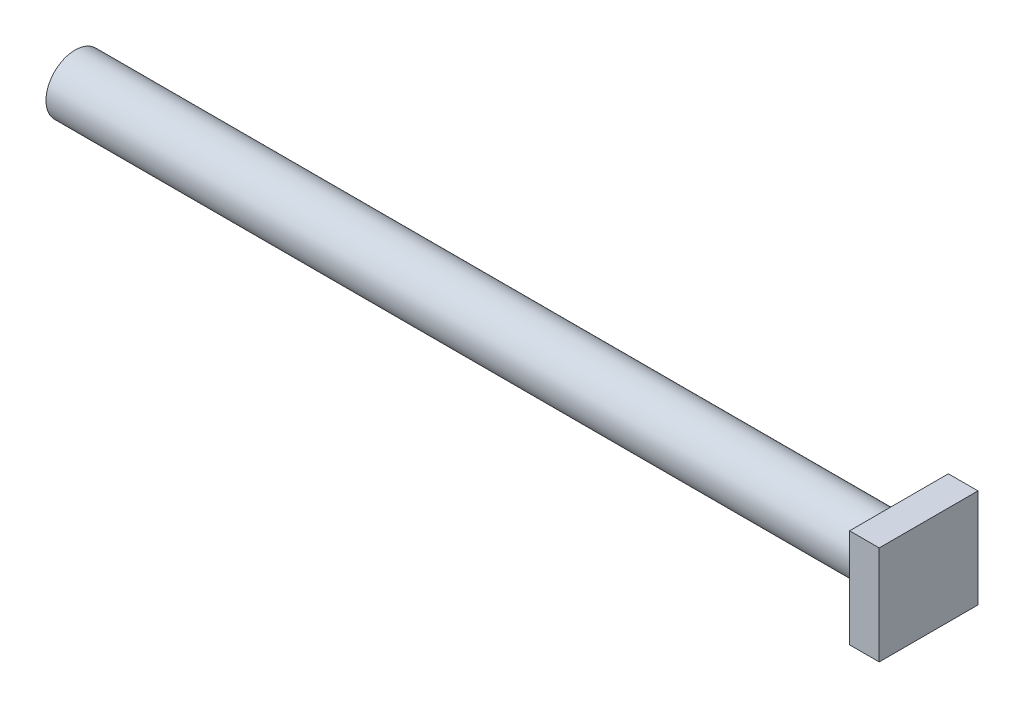
ISO-10303-21;
HEADER;
FILE_DESCRIPTION(('STEP AP214'),'2;1');
FILE_NAME('part.step','',(''),(''),'','','');
FILE_SCHEMA(('AUTOMOTIVE_DESIGN { 1 0 10303 214 1 1 1 1 }'));
ENDSEC;
DATA;
#1=APPLICATION_CONTEXT('core data for automotive mechanical design processes');
#2=APPLICATION_PROTOCOL_DEFINITION('international standard','automotive_design',2000,#1);
#3=PRODUCT_CONTEXT('',#1,'mechanical');
#4=PRODUCT('Part','Part','',(#3));
#5=PRODUCT_RELATED_PRODUCT_CATEGORY('part','',(#4));
#6=PRODUCT_DEFINITION_FORMATION('','',#4);
#7=PRODUCT_DEFINITION_CONTEXT('part definition',#1,'design');
#8=PRODUCT_DEFINITION('design','',#6,#7);
#9=PRODUCT_DEFINITION_SHAPE('','',#8);
#10=(LENGTH_UNIT() NAMED_UNIT(*) SI_UNIT(.MILLI.,.METRE.));
#11=(NAMED_UNIT(*) PLANE_ANGLE_UNIT() SI_UNIT($,.RADIAN.));
#12=(NAMED_UNIT(*) SI_UNIT($,.STERADIAN.) SOLID_ANGLE_UNIT());
#13=UNCERTAINTY_MEASURE_WITH_UNIT(LENGTH_MEASURE(1.E-05),#10,'distance_accuracy_value','');
#14=(GEOMETRIC_REPRESENTATION_CONTEXT(3) GLOBAL_UNCERTAINTY_ASSIGNED_CONTEXT((#13)) GLOBAL_UNIT_ASSIGNED_CONTEXT((#10,
#11,#12)) REPRESENTATION_CONTEXT('',''));
#15=CARTESIAN_POINT('',(0.,0.,0.));
#16=DIRECTION('',(0.,0.,1.));
#17=DIRECTION('',(1.,0.,0.));
#18=AXIS2_PLACEMENT_3D('',#15,#16,#17);
#19=CARTESIAN_POINT('',(-83.4,0.,0.));
#20=DIRECTION('',(1.,0.,0.));
#21=DIRECTION('',(0.,0.,-1.));
#22=AXIS2_PLACEMENT_3D('',#19,#20,#21);
#23=CYLINDRICAL_SURFACE('',#22,2.95);
#24=CARTESIAN_POINT('',(-83.4,0.,0.));
#25=DIRECTION('',(1.,0.,0.));
#26=DIRECTION('',(0.,0.,-1.));
#27=AXIS2_PLACEMENT_3D('',#24,#25,#26);
#28=CIRCLE('',#27,2.95);
#29=CARTESIAN_POINT('',(-83.4,0.,-2.95));
#30=VERTEX_POINT('',#29);
#31=EDGE_CURVE('E11',#30,#30,#28,.T.);
#32=ORIENTED_EDGE('',*,*,#31,.T.);
#33=EDGE_LOOP('',(#32));
#34=FACE_BOUND('',#33,.T.);
#35=CARTESIAN_POINT('',(0.,0.,0.));
#36=DIRECTION('',(1.,0.,0.));
#37=DIRECTION('',(0.,0.,-1.));
#38=AXIS2_PLACEMENT_3D('',#35,#36,#37);
#39=CIRCLE('',#38,2.95);
#40=CARTESIAN_POINT('',(0.,0.,-2.95));
#41=VERTEX_POINT('',#40);
#42=EDGE_CURVE('E48',#41,#41,#39,.T.);
#43=ORIENTED_EDGE('',*,*,#42,.F.);
#44=EDGE_LOOP('',(#43));
#45=FACE_BOUND('',#44,.T.);
#46=ADVANCED_FACE('F45',(#34,#45),#23,.T.);
#47=CARTESIAN_POINT('',(-83.4,0.,0.));
#48=DIRECTION('',(1.,0.,0.));
#49=DIRECTION('',(0.,0.,-1.));
#50=AXIS2_PLACEMENT_3D('',#47,#48,#49);
#51=PLANE('',#50);
#52=ORIENTED_EDGE('',*,*,#31,.F.);
#53=EDGE_LOOP('',(#52));
#54=FACE_BOUND('',#53,.T.);
#55=ADVANCED_FACE('F140',(#54),#51,.F.);
#56=CARTESIAN_POINT('',(3.,-5.,-5.));
#57=DIRECTION('',(0.,0.,1.));
#58=DIRECTION('',(1.,0.,0.));
#59=AXIS2_PLACEMENT_3D('',#56,#57,#58);
#60=PLANE('',#59);
#61=DIRECTION('',(0.,1.,0.));
#62=VECTOR('',#61,1.);
#63=CARTESIAN_POINT('',(0.,-5.,-5.));
#64=LINE('',#63,#62);
#65=CARTESIAN_POINT('',(0.,-5.,-5.));
#66=VERTEX_POINT('',#65);
#67=CARTESIAN_POINT('',(0.,5.,-5.));
#68=VERTEX_POINT('',#67);
#69=EDGE_CURVE('E117',#66,#68,#64,.T.);
#70=ORIENTED_EDGE('',*,*,#69,.T.);
#71=DIRECTION('',(-1.,0.,0.));
#72=VECTOR('',#71,1.);
#73=CARTESIAN_POINT('',(3.,5.,-5.));
#74=LINE('',#73,#72);
#75=CARTESIAN_POINT('',(3.,5.,-5.));
#76=VERTEX_POINT('',#75);
#77=EDGE_CURVE('E106',#76,#68,#74,.T.);
#78=ORIENTED_EDGE('',*,*,#77,.F.);
#79=DIRECTION('',(0.,1.,0.));
#80=VECTOR('',#79,1.);
#81=CARTESIAN_POINT('',(3.,-5.,-5.));
#82=LINE('',#81,#80);
#83=CARTESIAN_POINT('',(3.,-5.,-5.));
#84=VERTEX_POINT('',#83);
#85=EDGE_CURVE('E98',#84,#76,#82,.T.);
#86=ORIENTED_EDGE('',*,*,#85,.F.);
#87=DIRECTION('',(-1.,0.,0.));
#88=VECTOR('',#87,1.);
#89=CARTESIAN_POINT('',(3.,-5.,-5.));
#90=LINE('',#89,#88);
#91=EDGE_CURVE('E113',#84,#66,#90,.T.);
#92=ORIENTED_EDGE('',*,*,#91,.T.);
#93=EDGE_LOOP('',(#70,#78,#86,#92));
#94=FACE_BOUND('',#93,.T.);
#95=ADVANCED_FACE('F145',(#94),#60,.F.);
#96=CARTESIAN_POINT('',(3.,5.,5.));
#97=DIRECTION('',(0.,-1.,0.));
#98=DIRECTION('',(0.,0.,-1.));
#99=AXIS2_PLACEMENT_3D('',#96,#97,#98);
#100=PLANE('',#99);
#101=DIRECTION('',(0.,0.,1.));
#102=VECTOR('',#101,1.);
#103=CARTESIAN_POINT('',(0.,5.,5.));
#104=LINE('',#103,#102);
#105=CARTESIAN_POINT('',(0.,5.,5.));
#106=VERTEX_POINT('',#105);
#107=EDGE_CURVE('E104',#68,#106,#104,.T.);
#108=ORIENTED_EDGE('',*,*,#107,.T.);
#109=DIRECTION('',(-1.,0.,0.));
#110=VECTOR('',#109,1.);
#111=CARTESIAN_POINT('',(3.,5.,5.));
#112=LINE('',#111,#110);
#113=CARTESIAN_POINT('',(3.,5.,5.));
#114=VERTEX_POINT('',#113);
#115=EDGE_CURVE('E102',#114,#106,#112,.T.);
#116=ORIENTED_EDGE('',*,*,#115,.F.);
#117=DIRECTION('',(0.,0.,1.));
#118=VECTOR('',#117,1.);
#119=CARTESIAN_POINT('',(3.,5.,5.));
#120=LINE('',#119,#118);
#121=EDGE_CURVE('E93',#76,#114,#120,.T.);
#122=ORIENTED_EDGE('',*,*,#121,.F.);
#123=ORIENTED_EDGE('',*,*,#77,.T.);
#124=EDGE_LOOP('',(#108,#116,#122,#123));
#125=FACE_BOUND('',#124,.T.);
#126=ADVANCED_FACE('F103',(#125),#100,.F.);
#127=CARTESIAN_POINT('',(3.,-5.,5.));
#128=DIRECTION('',(0.,0.,-1.));
#129=DIRECTION('',(-1.,0.,0.));
#130=AXIS2_PLACEMENT_3D('',#127,#128,#129);
#131=PLANE('',#130);
#132=DIRECTION('',(0.,-1.,0.));
#133=VECTOR('',#132,1.);
#134=CARTESIAN_POINT('',(0.,-5.,5.));
#135=LINE('',#134,#133);
#136=CARTESIAN_POINT('',(0.,-5.,5.));
#137=VERTEX_POINT('',#136);
#138=EDGE_CURVE('E79',#106,#137,#135,.T.);
#139=ORIENTED_EDGE('',*,*,#138,.T.);
#140=DIRECTION('',(-1.,0.,0.));
#141=VECTOR('',#140,1.);
#142=CARTESIAN_POINT('',(3.,-5.,5.));
#143=LINE('',#142,#141);
#144=CARTESIAN_POINT('',(3.,-5.,5.));
#145=VERTEX_POINT('',#144);
#146=EDGE_CURVE('E107',#145,#137,#143,.T.);
#147=ORIENTED_EDGE('',*,*,#146,.F.);
#148=DIRECTION('',(0.,-1.,0.));
#149=VECTOR('',#148,1.);
#150=CARTESIAN_POINT('',(3.,-5.,5.));
#151=LINE('',#150,#149);
#152=EDGE_CURVE('E96',#114,#145,#151,.T.);
#153=ORIENTED_EDGE('',*,*,#152,.F.);
#154=ORIENTED_EDGE('',*,*,#115,.T.);
#155=EDGE_LOOP('',(#139,#147,#153,#154));
#156=FACE_BOUND('',#155,.T.);
#157=ADVANCED_FACE('F109',(#156),#131,.F.);
#158=CARTESIAN_POINT('',(3.,-5.,5.));
#159=DIRECTION('',(0.,1.,0.));
#160=DIRECTION('',(0.,0.,1.));
#161=AXIS2_PLACEMENT_3D('',#158,#159,#160);
#162=PLANE('',#161);
#163=DIRECTION('',(0.,0.,-1.));
#164=VECTOR('',#163,1.);
#165=CARTESIAN_POINT('',(0.,-5.,5.));
#166=LINE('',#165,#164);
#167=EDGE_CURVE('E85',#137,#66,#166,.T.);
#168=ORIENTED_EDGE('',*,*,#167,.T.);
#169=ORIENTED_EDGE('',*,*,#91,.F.);
#170=DIRECTION('',(0.,0.,-1.));
#171=VECTOR('',#170,1.);
#172=CARTESIAN_POINT('',(3.,-5.,5.));
#173=LINE('',#172,#171);
#174=EDGE_CURVE('E62',#145,#84,#173,.T.);
#175=ORIENTED_EDGE('',*,*,#174,.F.);
#176=ORIENTED_EDGE('',*,*,#146,.T.);
#177=EDGE_LOOP('',(#168,#169,#175,#176));
#178=FACE_BOUND('',#177,.T.);
#179=ADVANCED_FACE('F158',(#178),#162,.F.);
#180=CARTESIAN_POINT('',(3.,0.,0.));
#181=DIRECTION('',(-1.,0.,0.));
#182=DIRECTION('',(0.,0.,1.));
#183=AXIS2_PLACEMENT_3D('',#180,#181,#182);
#184=PLANE('',#183);
#185=ORIENTED_EDGE('',*,*,#85,.T.);
#186=ORIENTED_EDGE('',*,*,#121,.T.);
#187=ORIENTED_EDGE('',*,*,#152,.T.);
#188=ORIENTED_EDGE('',*,*,#174,.T.);
#189=EDGE_LOOP('',(#185,#186,#187,#188));
#190=FACE_BOUND('',#189,.T.);
#191=ADVANCED_FACE('F94',(#190),#184,.F.);
#192=CARTESIAN_POINT('',(0.,0.,0.));
#193=DIRECTION('',(-1.,0.,0.));
#194=DIRECTION('',(0.,0.,1.));
#195=AXIS2_PLACEMENT_3D('',#192,#193,#194);
#196=PLANE('',#195);
#197=ORIENTED_EDGE('',*,*,#42,.T.);
#198=EDGE_LOOP('',(#197));
#199=FACE_BOUND('',#198,.T.);
#200=ORIENTED_EDGE('',*,*,#69,.F.);
#201=ORIENTED_EDGE('',*,*,#167,.F.);
#202=ORIENTED_EDGE('',*,*,#138,.F.);
#203=ORIENTED_EDGE('',*,*,#107,.F.);
#204=EDGE_LOOP('',(#200,#201,#202,#203));
#205=FACE_BOUND('',#204,.T.);
#206=ADVANCED_FACE('F136',(#199,#205),#196,.T.);
#207=CLOSED_SHELL('',(#46,#55,#95,#126,#157,#179,#191,#206));
#208=MANIFOLD_SOLID_BREP('B2',#207);
#209=ADVANCED_BREP_SHAPE_REPRESENTATION('',(#18,#208),#14);
#210=SHAPE_DEFINITION_REPRESENTATION(#9,#209);
ENDSEC;
END-ISO-10303-21;
